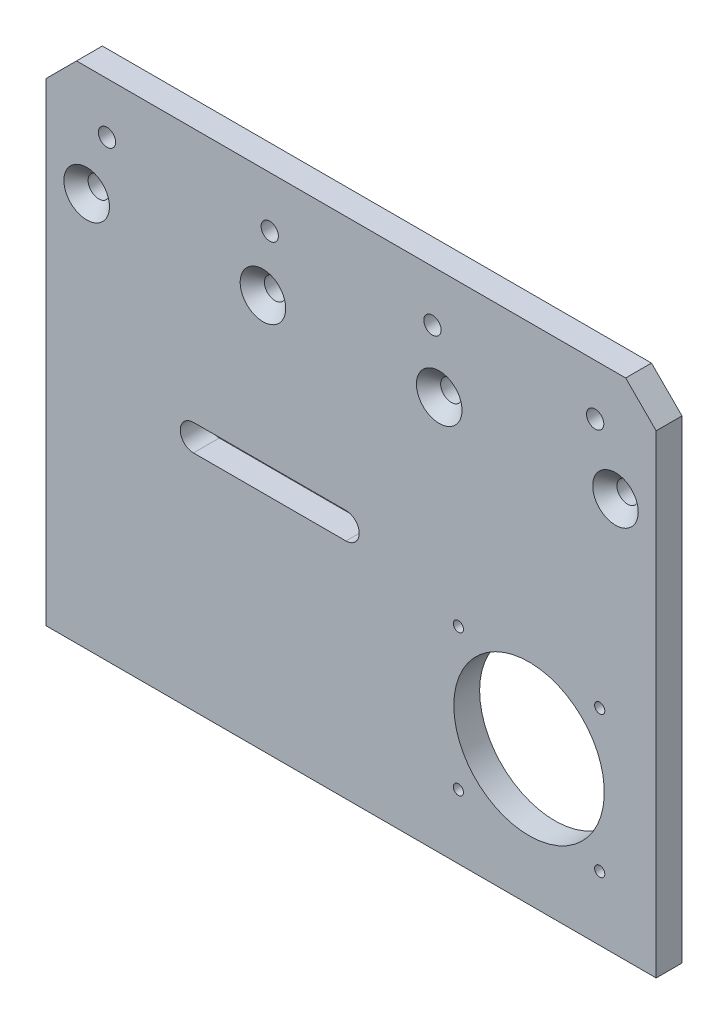
ISO-10303-21;
HEADER;
FILE_DESCRIPTION(('STEP AP214'),'2;1');
FILE_NAME('part.step','',(''),(''),'','','');
FILE_SCHEMA(('AUTOMOTIVE_DESIGN { 1 0 10303 214 1 1 1 1 }'));
ENDSEC;
DATA;
#1=APPLICATION_CONTEXT('core data for automotive mechanical design processes');
#2=APPLICATION_PROTOCOL_DEFINITION('international standard','automotive_design',2000,#1);
#3=PRODUCT_CONTEXT('',#1,'mechanical');
#4=PRODUCT('Part','Part','',(#3));
#5=PRODUCT_RELATED_PRODUCT_CATEGORY('part','',(#4));
#6=PRODUCT_DEFINITION_FORMATION('','',#4);
#7=PRODUCT_DEFINITION_CONTEXT('part definition',#1,'design');
#8=PRODUCT_DEFINITION('design','',#6,#7);
#9=PRODUCT_DEFINITION_SHAPE('','',#8);
#10=(LENGTH_UNIT() NAMED_UNIT(*) SI_UNIT(.MILLI.,.METRE.));
#11=(NAMED_UNIT(*) PLANE_ANGLE_UNIT() SI_UNIT($,.RADIAN.));
#12=(NAMED_UNIT(*) SI_UNIT($,.STERADIAN.) SOLID_ANGLE_UNIT());
#13=UNCERTAINTY_MEASURE_WITH_UNIT(LENGTH_MEASURE(1.E-05),#10,'distance_accuracy_value','');
#14=(GEOMETRIC_REPRESENTATION_CONTEXT(3) GLOBAL_UNCERTAINTY_ASSIGNED_CONTEXT((#13)) GLOBAL_UNIT_ASSIGNED_CONTEXT((#10,
#11,#12)) REPRESENTATION_CONTEXT('',''));
#15=CARTESIAN_POINT('',(0.,0.,0.));
#16=DIRECTION('',(0.,0.,1.));
#17=DIRECTION('',(1.,0.,0.));
#18=AXIS2_PLACEMENT_3D('',#15,#16,#17);
#19=CARTESIAN_POINT('',(-150.,-124.,-6.35));
#20=DIRECTION('',(-1.,0.,0.));
#21=DIRECTION('',(0.,0.,1.));
#22=AXIS2_PLACEMENT_3D('',#19,#20,#21);
#23=PLANE('',#22);
#24=DIRECTION('',(0.,-1.,0.));
#25=VECTOR('',#24,1.);
#26=CARTESIAN_POINT('',(-150.,-124.,6.35));
#27=LINE('',#26,#25);
#28=CARTESIAN_POINT('',(-150.,109.,6.35));
#29=VERTEX_POINT('',#28);
#30=CARTESIAN_POINT('',(-150.,-124.,6.35));
#31=VERTEX_POINT('',#30);
#32=EDGE_CURVE('E213',#29,#31,#27,.T.);
#33=ORIENTED_EDGE('',*,*,#32,.F.);
#34=DIRECTION('',(0.,0.,-1.));
#35=VECTOR('',#34,1.);
#36=CARTESIAN_POINT('',(-150.,109.,-6.35));
#37=LINE('',#36,#35);
#38=CARTESIAN_POINT('',(-150.,109.,-6.35));
#39=VERTEX_POINT('',#38);
#40=EDGE_CURVE('E243',#29,#39,#37,.T.);
#41=ORIENTED_EDGE('',*,*,#40,.T.);
#42=DIRECTION('',(0.,-1.,0.));
#43=VECTOR('',#42,1.);
#44=CARTESIAN_POINT('',(-150.,-124.,-6.35));
#45=LINE('',#44,#43);
#46=CARTESIAN_POINT('',(-150.,-124.,-6.35));
#47=VERTEX_POINT('',#46);
#48=EDGE_CURVE('E212',#39,#47,#45,.T.);
#49=ORIENTED_EDGE('',*,*,#48,.T.);
#50=DIRECTION('',(0.,0.,1.));
#51=VECTOR('',#50,1.);
#52=CARTESIAN_POINT('',(-150.,-124.,-6.35));
#53=LINE('',#52,#51);
#54=EDGE_CURVE('E228',#47,#31,#53,.T.);
#55=ORIENTED_EDGE('',*,*,#54,.T.);
#56=EDGE_LOOP('',(#33,#41,#49,#55));
#57=FACE_BOUND('',#56,.T.);
#58=ADVANCED_FACE('F50',(#57),#23,.T.);
#59=CARTESIAN_POINT('',(150.,124.,-6.35));
#60=DIRECTION('',(0.,1.,0.));
#61=DIRECTION('',(-1.,0.,0.));
#62=AXIS2_PLACEMENT_3D('',#59,#60,#61);
#63=PLANE('',#62);
#64=DIRECTION('',(-1.,0.,0.));
#65=VECTOR('',#64,1.);
#66=CARTESIAN_POINT('',(150.,124.,6.35));
#67=LINE('',#66,#65);
#68=CARTESIAN_POINT('',(135.,124.,6.35));
#69=VERTEX_POINT('',#68);
#70=CARTESIAN_POINT('',(-135.,124.,6.35));
#71=VERTEX_POINT('',#70);
#72=EDGE_CURVE('E217',#69,#71,#67,.T.);
#73=ORIENTED_EDGE('',*,*,#72,.F.);
#74=DIRECTION('',(0.,0.,-1.));
#75=VECTOR('',#74,1.);
#76=CARTESIAN_POINT('',(135.,124.,-6.35));
#77=LINE('',#76,#75);
#78=CARTESIAN_POINT('',(135.,124.,-6.35));
#79=VERTEX_POINT('',#78);
#80=EDGE_CURVE('E60',#69,#79,#77,.T.);
#81=ORIENTED_EDGE('',*,*,#80,.T.);
#82=DIRECTION('',(-1.,0.,0.));
#83=VECTOR('',#82,1.);
#84=CARTESIAN_POINT('',(150.,124.,-6.35));
#85=LINE('',#84,#83);
#86=CARTESIAN_POINT('',(-135.,124.,-6.35));
#87=VERTEX_POINT('',#86);
#88=EDGE_CURVE('E221',#79,#87,#85,.T.);
#89=ORIENTED_EDGE('',*,*,#88,.T.);
#90=DIRECTION('',(0.,0.,1.));
#91=VECTOR('',#90,1.);
#92=CARTESIAN_POINT('',(-135.,124.,-6.35));
#93=LINE('',#92,#91);
#94=EDGE_CURVE('E236',#87,#71,#93,.T.);
#95=ORIENTED_EDGE('',*,*,#94,.T.);
#96=EDGE_LOOP('',(#73,#81,#89,#95));
#97=FACE_BOUND('',#96,.T.);
#98=ADVANCED_FACE('F310',(#97),#63,.T.);
#99=CARTESIAN_POINT('',(150.,-124.,-6.35));
#100=DIRECTION('',(1.,0.,0.));
#101=DIRECTION('',(0.,1.,0.));
#102=AXIS2_PLACEMENT_3D('',#99,#100,#101);
#103=PLANE('',#102);
#104=DIRECTION('',(0.,1.,0.));
#105=VECTOR('',#104,1.);
#106=CARTESIAN_POINT('',(150.,-124.,-6.35));
#107=LINE('',#106,#105);
#108=CARTESIAN_POINT('',(150.,-124.,-6.35));
#109=VERTEX_POINT('',#108);
#110=CARTESIAN_POINT('',(150.,109.,-6.35));
#111=VERTEX_POINT('',#110);
#112=EDGE_CURVE('E222',#109,#111,#107,.T.);
#113=ORIENTED_EDGE('',*,*,#112,.T.);
#114=DIRECTION('',(0.,0.,1.));
#115=VECTOR('',#114,1.);
#116=CARTESIAN_POINT('',(150.,109.,-6.35));
#117=LINE('',#116,#115);
#118=CARTESIAN_POINT('',(150.,109.,6.35));
#119=VERTEX_POINT('',#118);
#120=EDGE_CURVE('E246',#111,#119,#117,.T.);
#121=ORIENTED_EDGE('',*,*,#120,.T.);
#122=DIRECTION('',(0.,1.,0.));
#123=VECTOR('',#122,1.);
#124=CARTESIAN_POINT('',(150.,-124.,6.35));
#125=LINE('',#124,#123);
#126=CARTESIAN_POINT('',(150.,-124.,6.35));
#127=VERTEX_POINT('',#126);
#128=EDGE_CURVE('E232',#127,#119,#125,.T.);
#129=ORIENTED_EDGE('',*,*,#128,.F.);
#130=DIRECTION('',(0.,0.,1.));
#131=VECTOR('',#130,1.);
#132=CARTESIAN_POINT('',(150.,-124.,-6.35));
#133=LINE('',#132,#131);
#134=EDGE_CURVE('E233',#109,#127,#133,.T.);
#135=ORIENTED_EDGE('',*,*,#134,.F.);
#136=EDGE_LOOP('',(#113,#121,#129,#135));
#137=FACE_BOUND('',#136,.T.);
#138=ADVANCED_FACE('F313',(#137),#103,.T.);
#139=CARTESIAN_POINT('',(150.,-124.,-6.35));
#140=DIRECTION('',(0.,-1.,0.));
#141=DIRECTION('',(1.,0.,0.));
#142=AXIS2_PLACEMENT_3D('',#139,#140,#141);
#143=PLANE('',#142);
#144=DIRECTION('',(1.,0.,0.));
#145=VECTOR('',#144,1.);
#146=CARTESIAN_POINT('',(150.,-124.,6.35));
#147=LINE('',#146,#145);
#148=EDGE_CURVE('E227',#31,#127,#147,.T.);
#149=ORIENTED_EDGE('',*,*,#148,.F.);
#150=ORIENTED_EDGE('',*,*,#54,.F.);
#151=DIRECTION('',(1.,0.,0.));
#152=VECTOR('',#151,1.);
#153=CARTESIAN_POINT('',(150.,-124.,-6.35));
#154=LINE('',#153,#152);
#155=EDGE_CURVE('E220',#47,#109,#154,.T.);
#156=ORIENTED_EDGE('',*,*,#155,.T.);
#157=ORIENTED_EDGE('',*,*,#134,.T.);
#158=EDGE_LOOP('',(#149,#150,#156,#157));
#159=FACE_BOUND('',#158,.T.);
#160=ADVANCED_FACE('F318',(#159),#143,.T.);
#161=CARTESIAN_POINT('',(0.,0.,-6.35));
#162=DIRECTION('',(0.,0.,1.));
#163=DIRECTION('',(1.,0.,0.));
#164=AXIS2_PLACEMENT_3D('',#161,#162,#163);
#165=PLANE('',#164);
#166=CARTESIAN_POINT('',(-130.,70.,-6.35));
#167=DIRECTION('',(0.,0.,1.));
#168=DIRECTION('',(1.,0.,0.));
#169=AXIS2_PLACEMENT_3D('',#166,#167,#168);
#170=CIRCLE('',#169,5.24999999999999);
#171=CARTESIAN_POINT('',(-124.75,70.,-6.35));
#172=VERTEX_POINT('',#171);
#173=EDGE_CURVE('E55',#172,#172,#170,.T.);
#174=ORIENTED_EDGE('',*,*,#173,.T.);
#175=EDGE_LOOP('',(#174));
#176=FACE_BOUND('',#175,.T.);
#177=CARTESIAN_POINT('',(-43.3333333333334,70.,-6.35));
#178=DIRECTION('',(0.,0.,1.));
#179=DIRECTION('',(1.,0.,0.));
#180=AXIS2_PLACEMENT_3D('',#177,#178,#179);
#181=CIRCLE('',#180,5.24999999999999);
#182=CARTESIAN_POINT('',(-38.0833333333334,70.,-6.35));
#183=VERTEX_POINT('',#182);
#184=EDGE_CURVE('E270',#183,#183,#181,.T.);
#185=ORIENTED_EDGE('',*,*,#184,.T.);
#186=EDGE_LOOP('',(#185));
#187=FACE_BOUND('',#186,.T.);
#188=CARTESIAN_POINT('',(43.3333333333333,70.,-6.35));
#189=DIRECTION('',(0.,0.,1.));
#190=DIRECTION('',(1.,0.,0.));
#191=AXIS2_PLACEMENT_3D('',#188,#189,#190);
#192=CIRCLE('',#191,5.24999999999999);
#193=CARTESIAN_POINT('',(48.5833333333333,70.,-6.35));
#194=VERTEX_POINT('',#193);
#195=EDGE_CURVE('E261',#194,#194,#192,.T.);
#196=ORIENTED_EDGE('',*,*,#195,.T.);
#197=EDGE_LOOP('',(#196));
#198=FACE_BOUND('',#197,.T.);
#199=CARTESIAN_POINT('',(130.,70.,-6.35));
#200=DIRECTION('',(0.,0.,1.));
#201=DIRECTION('',(1.,0.,0.));
#202=AXIS2_PLACEMENT_3D('',#199,#200,#201);
#203=CIRCLE('',#202,5.25);
#204=CARTESIAN_POINT('',(135.25,70.,-6.35));
#205=VERTEX_POINT('',#204);
#206=EDGE_CURVE('E160',#205,#205,#203,.T.);
#207=ORIENTED_EDGE('',*,*,#206,.T.);
#208=EDGE_LOOP('',(#207));
#209=FACE_BOUND('',#208,.T.);
#210=DIRECTION('',(1.,0.,0.));
#211=VECTOR('',#210,1.);
#212=CARTESIAN_POINT('',(-2.50000000000003,-14.164450338933,-6.35));
#213=LINE('',#212,#211);
#214=CARTESIAN_POINT('',(-77.5,-14.164450338933,-6.35));
#215=VERTEX_POINT('',#214);
#216=CARTESIAN_POINT('',(-2.50000000000003,-14.164450338933,-6.35));
#217=VERTEX_POINT('',#216);
#218=EDGE_CURVE('E131',#215,#217,#213,.T.);
#219=ORIENTED_EDGE('',*,*,#218,.T.);
#220=CARTESIAN_POINT('',(-2.50000000000003,-7.66445033893303,-6.35));
#221=DIRECTION('',(0.,0.,1.));
#222=DIRECTION('',(1.,0.,0.));
#223=AXIS2_PLACEMENT_3D('',#220,#221,#222);
#224=CIRCLE('',#223,6.5);
#225=CARTESIAN_POINT('',(-2.50000000000003,-1.16445033893304,-6.35));
#226=VERTEX_POINT('',#225);
#227=EDGE_CURVE('E127',#217,#226,#224,.T.);
#228=ORIENTED_EDGE('',*,*,#227,.T.);
#229=DIRECTION('',(-1.,0.,0.));
#230=VECTOR('',#229,1.);
#231=CARTESIAN_POINT('',(-2.50000000000003,-1.16445033893304,-6.35));
#232=LINE('',#231,#230);
#233=CARTESIAN_POINT('',(-77.5,-1.16445033893304,-6.35));
#234=VERTEX_POINT('',#233);
#235=EDGE_CURVE('E136',#226,#234,#232,.T.);
#236=ORIENTED_EDGE('',*,*,#235,.T.);
#237=CARTESIAN_POINT('',(-77.5,-7.66445033893304,-6.35));
#238=DIRECTION('',(0.,0.,1.));
#239=DIRECTION('',(1.,0.,0.));
#240=AXIS2_PLACEMENT_3D('',#237,#238,#239);
#241=CIRCLE('',#240,6.5);
#242=EDGE_CURVE('E62',#234,#215,#241,.T.);
#243=ORIENTED_EDGE('',*,*,#242,.T.);
#244=EDGE_LOOP('',(#219,#228,#236,#243));
#245=FACE_BOUND('',#244,.T.);
#246=CARTESIAN_POINT('',(122.25,-22.914450338933,-6.35));
#247=DIRECTION('',(0.,0.,-1.));
#248=DIRECTION('',(-1.,0.,0.));
#249=AXIS2_PLACEMENT_3D('',#246,#247,#248);
#250=CIRCLE('',#249,2.49999999999999);
#251=CARTESIAN_POINT('',(119.75,-22.914450338933,-6.35));
#252=VERTEX_POINT('',#251);
#253=EDGE_CURVE('E165',#252,#252,#250,.T.);
#254=ORIENTED_EDGE('',*,*,#253,.F.);
#255=EDGE_LOOP('',(#254));
#256=FACE_BOUND('',#255,.T.);
#257=CARTESIAN_POINT('',(52.75,-92.414450338933,-6.35));
#258=DIRECTION('',(0.,0.,-1.));
#259=DIRECTION('',(-1.,0.,0.));
#260=AXIS2_PLACEMENT_3D('',#257,#258,#259);
#261=CIRCLE('',#260,2.49999999999999);
#262=CARTESIAN_POINT('',(50.25,-92.414450338933,-6.35));
#263=VERTEX_POINT('',#262);
#264=EDGE_CURVE('E175',#263,#263,#261,.T.);
#265=ORIENTED_EDGE('',*,*,#264,.F.);
#266=EDGE_LOOP('',(#265));
#267=FACE_BOUND('',#266,.T.);
#268=CARTESIAN_POINT('',(52.75,-22.914450338933,-6.35));
#269=DIRECTION('',(0.,0.,-1.));
#270=DIRECTION('',(-1.,0.,0.));
#271=AXIS2_PLACEMENT_3D('',#268,#269,#270);
#272=CIRCLE('',#271,2.49999999999999);
#273=CARTESIAN_POINT('',(50.25,-22.914450338933,-6.35));
#274=VERTEX_POINT('',#273);
#275=EDGE_CURVE('E180',#274,#274,#272,.T.);
#276=ORIENTED_EDGE('',*,*,#275,.F.);
#277=EDGE_LOOP('',(#276));
#278=FACE_BOUND('',#277,.T.);
#279=CARTESIAN_POINT('',(122.25,-92.414450338933,-6.35));
#280=DIRECTION('',(0.,0.,-1.));
#281=DIRECTION('',(-1.,0.,0.));
#282=AXIS2_PLACEMENT_3D('',#279,#280,#281);
#283=CIRCLE('',#282,2.49999999999999);
#284=CARTESIAN_POINT('',(119.75,-92.414450338933,-6.35));
#285=VERTEX_POINT('',#284);
#286=EDGE_CURVE('E185',#285,#285,#283,.T.);
#287=ORIENTED_EDGE('',*,*,#286,.F.);
#288=EDGE_LOOP('',(#287));
#289=FACE_BOUND('',#288,.T.);
#290=CARTESIAN_POINT('',(87.5,-57.664450338933,-6.35));
#291=DIRECTION('',(0.,0.,-1.));
#292=DIRECTION('',(-1.,0.,0.));
#293=AXIS2_PLACEMENT_3D('',#290,#291,#292);
#294=CIRCLE('',#293,37.0000000000001);
#295=CARTESIAN_POINT('',(50.4999999999999,-57.664450338933,-6.35));
#296=VERTEX_POINT('',#295);
#297=EDGE_CURVE('E187',#296,#296,#294,.T.);
#298=ORIENTED_EDGE('',*,*,#297,.F.);
#299=EDGE_LOOP('',(#298));
#300=FACE_BOUND('',#299,.T.);
#301=CARTESIAN_POINT('',(-40.,99.,-6.35));
#302=DIRECTION('',(0.,0.,1.));
#303=DIRECTION('',(1.,0.,0.));
#304=AXIS2_PLACEMENT_3D('',#301,#302,#303);
#305=CIRCLE('',#304,4.24999999999999);
#306=CARTESIAN_POINT('',(-35.75,99.,-6.35));
#307=VERTEX_POINT('',#306);
#308=EDGE_CURVE('E197',#307,#307,#305,.T.);
#309=ORIENTED_EDGE('',*,*,#308,.T.);
#310=EDGE_LOOP('',(#309));
#311=FACE_BOUND('',#310,.T.);
#312=CARTESIAN_POINT('',(-120.,99.,-6.35));
#313=DIRECTION('',(0.,0.,1.));
#314=DIRECTION('',(1.,0.,0.));
#315=AXIS2_PLACEMENT_3D('',#312,#313,#314);
#316=CIRCLE('',#315,4.24999999999999);
#317=CARTESIAN_POINT('',(-115.75,99.,-6.35));
#318=VERTEX_POINT('',#317);
#319=EDGE_CURVE('E202',#318,#318,#316,.T.);
#320=ORIENTED_EDGE('',*,*,#319,.T.);
#321=EDGE_LOOP('',(#320));
#322=FACE_BOUND('',#321,.T.);
#323=CARTESIAN_POINT('',(40.,99.,-6.35));
#324=DIRECTION('',(0.,0.,1.));
#325=DIRECTION('',(1.,0.,0.));
#326=AXIS2_PLACEMENT_3D('',#323,#324,#325);
#327=CIRCLE('',#326,4.24999999999999);
#328=CARTESIAN_POINT('',(44.25,99.,-6.35));
#329=VERTEX_POINT('',#328);
#330=EDGE_CURVE('E210',#329,#329,#327,.T.);
#331=ORIENTED_EDGE('',*,*,#330,.T.);
#332=EDGE_LOOP('',(#331));
#333=FACE_BOUND('',#332,.T.);
#334=CARTESIAN_POINT('',(120.,99.,-6.35));
#335=DIRECTION('',(0.,0.,1.));
#336=DIRECTION('',(1.,0.,0.));
#337=AXIS2_PLACEMENT_3D('',#334,#335,#336);
#338=CIRCLE('',#337,4.24999999999999);
#339=CARTESIAN_POINT('',(124.25,99.,-6.35));
#340=VERTEX_POINT('',#339);
#341=EDGE_CURVE('E214',#340,#340,#338,.T.);
#342=ORIENTED_EDGE('',*,*,#341,.T.);
#343=EDGE_LOOP('',(#342));
#344=FACE_BOUND('',#343,.T.);
#345=ORIENTED_EDGE('',*,*,#88,.F.);
#346=DIRECTION('',(-0.707106781186547,0.707106781186548,0.));
#347=VECTOR('',#346,1.);
#348=CARTESIAN_POINT('',(150.,109.,-6.35));
#349=LINE('',#348,#347);
#350=EDGE_CURVE('E11',#79,#111,#349,.F.);
#351=ORIENTED_EDGE('',*,*,#350,.T.);
#352=ORIENTED_EDGE('',*,*,#112,.F.);
#353=ORIENTED_EDGE('',*,*,#155,.F.);
#354=ORIENTED_EDGE('',*,*,#48,.F.);
#355=DIRECTION('',(-0.707106781186548,-0.707106781186548,0.));
#356=VECTOR('',#355,1.);
#357=CARTESIAN_POINT('',(-135.,124.,-6.35));
#358=LINE('',#357,#356);
#359=EDGE_CURVE('E247',#39,#87,#358,.F.);
#360=ORIENTED_EDGE('',*,*,#359,.T.);
#361=EDGE_LOOP('',(#345,#351,#352,#353,#354,#360));
#362=FACE_BOUND('',#361,.T.);
#363=ADVANCED_FACE('F141',(#176,#187,#198,#209,#245,#256,#267,#278,#289,#300,#311,#322,#333,
#344,#362),#165,.F.);
#364=CARTESIAN_POINT('',(0.,0.,6.35));
#365=DIRECTION('',(0.,0.,1.));
#366=DIRECTION('',(1.,0.,0.));
#367=AXIS2_PLACEMENT_3D('',#364,#365,#366);
#368=PLANE('',#367);
#369=CARTESIAN_POINT('',(-130.,70.,6.35));
#370=DIRECTION('',(0.,0.,1.));
#371=DIRECTION('',(1.,0.,0.));
#372=AXIS2_PLACEMENT_3D('',#369,#370,#371);
#373=CIRCLE('',#372,11.2);
#374=CARTESIAN_POINT('',(-118.8,70.,6.35));
#375=VERTEX_POINT('',#374);
#376=EDGE_CURVE('E554',#375,#375,#373,.T.);
#377=ORIENTED_EDGE('',*,*,#376,.F.);
#378=EDGE_LOOP('',(#377));
#379=FACE_BOUND('',#378,.T.);
#380=CARTESIAN_POINT('',(-43.3333333333334,70.,6.35));
#381=DIRECTION('',(0.,0.,1.));
#382=DIRECTION('',(1.,0.,0.));
#383=AXIS2_PLACEMENT_3D('',#380,#381,#382);
#384=CIRCLE('',#383,11.2);
#385=CARTESIAN_POINT('',(-32.1333333333334,70.,6.35));
#386=VERTEX_POINT('',#385);
#387=EDGE_CURVE('E276',#386,#386,#384,.T.);
#388=ORIENTED_EDGE('',*,*,#387,.F.);
#389=EDGE_LOOP('',(#388));
#390=FACE_BOUND('',#389,.T.);
#391=CARTESIAN_POINT('',(43.3333333333333,70.,6.35));
#392=DIRECTION('',(0.,0.,1.));
#393=DIRECTION('',(1.,0.,0.));
#394=AXIS2_PLACEMENT_3D('',#391,#392,#393);
#395=CIRCLE('',#394,11.2);
#396=CARTESIAN_POINT('',(54.5333333333333,70.,6.35));
#397=VERTEX_POINT('',#396);
#398=EDGE_CURVE('E267',#397,#397,#395,.T.);
#399=ORIENTED_EDGE('',*,*,#398,.F.);
#400=EDGE_LOOP('',(#399));
#401=FACE_BOUND('',#400,.T.);
#402=CARTESIAN_POINT('',(130.,70.,6.35));
#403=DIRECTION('',(0.,0.,1.));
#404=DIRECTION('',(1.,0.,0.));
#405=AXIS2_PLACEMENT_3D('',#402,#403,#404);
#406=CIRCLE('',#405,11.2);
#407=CARTESIAN_POINT('',(141.2,70.,6.35));
#408=VERTEX_POINT('',#407);
#409=EDGE_CURVE('E262',#408,#408,#406,.T.);
#410=ORIENTED_EDGE('',*,*,#409,.F.);
#411=EDGE_LOOP('',(#410));
#412=FACE_BOUND('',#411,.T.);
#413=CARTESIAN_POINT('',(-2.50000000000003,-7.66445033893303,6.35));
#414=DIRECTION('',(0.,0.,1.));
#415=DIRECTION('',(1.,0.,0.));
#416=AXIS2_PLACEMENT_3D('',#413,#414,#415);
#417=CIRCLE('',#416,6.5);
#418=CARTESIAN_POINT('',(-2.50000000000003,-14.164450338933,6.35));
#419=VERTEX_POINT('',#418);
#420=CARTESIAN_POINT('',(-2.50000000000003,-1.16445033893304,6.35));
#421=VERTEX_POINT('',#420);
#422=EDGE_CURVE('E74',#419,#421,#417,.T.);
#423=ORIENTED_EDGE('',*,*,#422,.F.);
#424=DIRECTION('',(1.,0.,0.));
#425=VECTOR('',#424,1.);
#426=CARTESIAN_POINT('',(-2.50000000000003,-14.164450338933,6.35));
#427=LINE('',#426,#425);
#428=CARTESIAN_POINT('',(-77.5,-14.164450338933,6.35));
#429=VERTEX_POINT('',#428);
#430=EDGE_CURVE('E143',#429,#419,#427,.T.);
#431=ORIENTED_EDGE('',*,*,#430,.F.);
#432=CARTESIAN_POINT('',(-77.5,-7.66445033893304,6.35));
#433=DIRECTION('',(0.,0.,1.));
#434=DIRECTION('',(1.,0.,0.));
#435=AXIS2_PLACEMENT_3D('',#432,#433,#434);
#436=CIRCLE('',#435,6.5);
#437=CARTESIAN_POINT('',(-77.5,-1.16445033893304,6.35));
#438=VERTEX_POINT('',#437);
#439=EDGE_CURVE('E150',#438,#429,#436,.T.);
#440=ORIENTED_EDGE('',*,*,#439,.F.);
#441=DIRECTION('',(-1.,0.,0.));
#442=VECTOR('',#441,1.);
#443=CARTESIAN_POINT('',(-2.50000000000003,-1.16445033893304,6.35));
#444=LINE('',#443,#442);
#445=EDGE_CURVE('E157',#421,#438,#444,.T.);
#446=ORIENTED_EDGE('',*,*,#445,.F.);
#447=EDGE_LOOP('',(#423,#431,#440,#446));
#448=FACE_BOUND('',#447,.T.);
#449=CARTESIAN_POINT('',(122.25,-22.914450338933,6.35));
#450=DIRECTION('',(0.,0.,-1.));
#451=DIRECTION('',(-1.,0.,0.));
#452=AXIS2_PLACEMENT_3D('',#449,#450,#451);
#453=CIRCLE('',#452,2.5);
#454=CARTESIAN_POINT('',(119.75,-22.914450338933,6.35));
#455=VERTEX_POINT('',#454);
#456=EDGE_CURVE('E168',#455,#455,#453,.T.);
#457=ORIENTED_EDGE('',*,*,#456,.T.);
#458=EDGE_LOOP('',(#457));
#459=FACE_BOUND('',#458,.T.);
#460=CARTESIAN_POINT('',(52.75,-92.414450338933,6.35));
#461=DIRECTION('',(0.,0.,-1.));
#462=DIRECTION('',(-1.,0.,0.));
#463=AXIS2_PLACEMENT_3D('',#460,#461,#462);
#464=CIRCLE('',#463,2.5);
#465=CARTESIAN_POINT('',(50.25,-92.414450338933,6.35));
#466=VERTEX_POINT('',#465);
#467=EDGE_CURVE('E173',#466,#466,#464,.T.);
#468=ORIENTED_EDGE('',*,*,#467,.T.);
#469=EDGE_LOOP('',(#468));
#470=FACE_BOUND('',#469,.T.);
#471=CARTESIAN_POINT('',(52.75,-22.914450338933,6.35));
#472=DIRECTION('',(0.,0.,-1.));
#473=DIRECTION('',(-1.,0.,0.));
#474=AXIS2_PLACEMENT_3D('',#471,#472,#473);
#475=CIRCLE('',#474,2.5);
#476=CARTESIAN_POINT('',(50.25,-22.914450338933,6.35));
#477=VERTEX_POINT('',#476);
#478=EDGE_CURVE('E183',#477,#477,#475,.T.);
#479=ORIENTED_EDGE('',*,*,#478,.T.);
#480=EDGE_LOOP('',(#479));
#481=FACE_BOUND('',#480,.T.);
#482=CARTESIAN_POINT('',(122.25,-92.414450338933,6.35));
#483=DIRECTION('',(0.,0.,-1.));
#484=DIRECTION('',(-1.,0.,0.));
#485=AXIS2_PLACEMENT_3D('',#482,#483,#484);
#486=CIRCLE('',#485,2.5);
#487=CARTESIAN_POINT('',(119.75,-92.414450338933,6.35));
#488=VERTEX_POINT('',#487);
#489=EDGE_CURVE('E190',#488,#488,#486,.T.);
#490=ORIENTED_EDGE('',*,*,#489,.T.);
#491=EDGE_LOOP('',(#490));
#492=FACE_BOUND('',#491,.T.);
#493=CARTESIAN_POINT('',(87.5,-57.664450338933,6.35));
#494=DIRECTION('',(0.,0.,-1.));
#495=DIRECTION('',(-1.,0.,0.));
#496=AXIS2_PLACEMENT_3D('',#493,#494,#495);
#497=CIRCLE('',#496,37.0000000000001);
#498=CARTESIAN_POINT('',(50.4999999999999,-57.664450338933,6.35));
#499=VERTEX_POINT('',#498);
#500=EDGE_CURVE('E191',#499,#499,#497,.T.);
#501=ORIENTED_EDGE('',*,*,#500,.T.);
#502=EDGE_LOOP('',(#501));
#503=FACE_BOUND('',#502,.T.);
#504=CARTESIAN_POINT('',(-40.,99.,6.35));
#505=DIRECTION('',(0.,0.,1.));
#506=DIRECTION('',(1.,0.,0.));
#507=AXIS2_PLACEMENT_3D('',#504,#505,#506);
#508=CIRCLE('',#507,4.24999999999999);
#509=CARTESIAN_POINT('',(-35.75,99.,6.35));
#510=VERTEX_POINT('',#509);
#511=EDGE_CURVE('E192',#510,#510,#508,.T.);
#512=ORIENTED_EDGE('',*,*,#511,.F.);
#513=EDGE_LOOP('',(#512));
#514=FACE_BOUND('',#513,.T.);
#515=CARTESIAN_POINT('',(-120.,99.,6.35));
#516=DIRECTION('',(0.,0.,1.));
#517=DIRECTION('',(1.,0.,0.));
#518=AXIS2_PLACEMENT_3D('',#515,#516,#517);
#519=CIRCLE('',#518,4.24999999999999);
#520=CARTESIAN_POINT('',(-115.75,99.,6.35));
#521=VERTEX_POINT('',#520);
#522=EDGE_CURVE('E199',#521,#521,#519,.T.);
#523=ORIENTED_EDGE('',*,*,#522,.F.);
#524=EDGE_LOOP('',(#523));
#525=FACE_BOUND('',#524,.T.);
#526=CARTESIAN_POINT('',(40.,99.,6.35));
#527=DIRECTION('',(0.,0.,1.));
#528=DIRECTION('',(1.,0.,0.));
#529=AXIS2_PLACEMENT_3D('',#526,#527,#528);
#530=CIRCLE('',#529,4.24999999999999);
#531=CARTESIAN_POINT('',(44.25,99.,6.35));
#532=VERTEX_POINT('',#531);
#533=EDGE_CURVE('E203',#532,#532,#530,.T.);
#534=ORIENTED_EDGE('',*,*,#533,.F.);
#535=EDGE_LOOP('',(#534));
#536=FACE_BOUND('',#535,.T.);
#537=CARTESIAN_POINT('',(120.,99.,6.35));
#538=DIRECTION('',(0.,0.,1.));
#539=DIRECTION('',(1.,0.,0.));
#540=AXIS2_PLACEMENT_3D('',#537,#538,#539);
#541=CIRCLE('',#540,4.24999999999999);
#542=CARTESIAN_POINT('',(124.25,99.,6.35));
#543=VERTEX_POINT('',#542);
#544=EDGE_CURVE('E209',#543,#543,#541,.T.);
#545=ORIENTED_EDGE('',*,*,#544,.F.);
#546=EDGE_LOOP('',(#545));
#547=FACE_BOUND('',#546,.T.);
#548=ORIENTED_EDGE('',*,*,#128,.T.);
#549=DIRECTION('',(0.707106781186547,-0.707106781186548,0.));
#550=VECTOR('',#549,1.);
#551=CARTESIAN_POINT('',(129.5,129.5,6.35));
#552=LINE('',#551,#550);
#553=EDGE_CURVE('E251',#119,#69,#552,.F.);
#554=ORIENTED_EDGE('',*,*,#553,.T.);
#555=ORIENTED_EDGE('',*,*,#72,.T.);
#556=DIRECTION('',(0.707106781186548,0.707106781186548,0.));
#557=VECTOR('',#556,1.);
#558=CARTESIAN_POINT('',(-129.5,129.5,6.35));
#559=LINE('',#558,#557);
#560=EDGE_CURVE('E245',#71,#29,#559,.F.);
#561=ORIENTED_EDGE('',*,*,#560,.T.);
#562=ORIENTED_EDGE('',*,*,#32,.T.);
#563=ORIENTED_EDGE('',*,*,#148,.T.);
#564=EDGE_LOOP('',(#548,#554,#555,#561,#562,#563));
#565=FACE_BOUND('',#564,.T.);
#566=ADVANCED_FACE('F329',(#379,#390,#401,#412,#448,#459,#470,#481,#492,#503,#514,#525,#536,
#547,#565),#368,.T.);
#567=CARTESIAN_POINT('',(-135.,124.,-6.35));
#568=DIRECTION('',(0.707106781186548,-0.707106781186548,0.));
#569=DIRECTION('',(0.,0.,1.));
#570=AXIS2_PLACEMENT_3D('',#567,#568,#569);
#571=PLANE('',#570);
#572=ORIENTED_EDGE('',*,*,#359,.F.);
#573=ORIENTED_EDGE('',*,*,#40,.F.);
#574=ORIENTED_EDGE('',*,*,#560,.F.);
#575=ORIENTED_EDGE('',*,*,#94,.F.);
#576=EDGE_LOOP('',(#572,#573,#574,#575));
#577=FACE_BOUND('',#576,.T.);
#578=ADVANCED_FACE('F325',(#577),#571,.F.);
#579=CARTESIAN_POINT('',(150.,109.,-6.35));
#580=DIRECTION('',(-0.707106781186548,-0.707106781186547,0.));
#581=DIRECTION('',(0.,0.,1.));
#582=AXIS2_PLACEMENT_3D('',#579,#580,#581);
#583=PLANE('',#582);
#584=ORIENTED_EDGE('',*,*,#350,.F.);
#585=ORIENTED_EDGE('',*,*,#80,.F.);
#586=ORIENTED_EDGE('',*,*,#553,.F.);
#587=ORIENTED_EDGE('',*,*,#120,.F.);
#588=EDGE_LOOP('',(#584,#585,#586,#587));
#589=FACE_BOUND('',#588,.T.);
#590=ADVANCED_FACE('F49',(#589),#583,.F.);
#591=CARTESIAN_POINT('',(120.,99.,6.35));
#592=DIRECTION('',(0.,0.,1.));
#593=DIRECTION('',(1.,0.,0.));
#594=AXIS2_PLACEMENT_3D('',#591,#592,#593);
#595=CYLINDRICAL_SURFACE('',#594,4.24999999999999);
#596=ORIENTED_EDGE('',*,*,#544,.T.);
#597=EDGE_LOOP('',(#596));
#598=FACE_BOUND('',#597,.T.);
#599=ORIENTED_EDGE('',*,*,#341,.F.);
#600=EDGE_LOOP('',(#599));
#601=FACE_BOUND('',#600,.T.);
#602=ADVANCED_FACE('F332',(#598,#601),#595,.F.);
#603=CARTESIAN_POINT('',(40.,99.,6.35));
#604=DIRECTION('',(0.,0.,1.));
#605=DIRECTION('',(1.,0.,0.));
#606=AXIS2_PLACEMENT_3D('',#603,#604,#605);
#607=CYLINDRICAL_SURFACE('',#606,4.24999999999999);
#608=ORIENTED_EDGE('',*,*,#533,.T.);
#609=EDGE_LOOP('',(#608));
#610=FACE_BOUND('',#609,.T.);
#611=ORIENTED_EDGE('',*,*,#330,.F.);
#612=EDGE_LOOP('',(#611));
#613=FACE_BOUND('',#612,.T.);
#614=ADVANCED_FACE('F363',(#610,#613),#607,.F.);
#615=CARTESIAN_POINT('',(-120.,99.,6.35));
#616=DIRECTION('',(0.,0.,1.));
#617=DIRECTION('',(1.,0.,0.));
#618=AXIS2_PLACEMENT_3D('',#615,#616,#617);
#619=CYLINDRICAL_SURFACE('',#618,4.24999999999999);
#620=ORIENTED_EDGE('',*,*,#522,.T.);
#621=EDGE_LOOP('',(#620));
#622=FACE_BOUND('',#621,.T.);
#623=ORIENTED_EDGE('',*,*,#319,.F.);
#624=EDGE_LOOP('',(#623));
#625=FACE_BOUND('',#624,.T.);
#626=ADVANCED_FACE('F367',(#622,#625),#619,.F.);
#627=CARTESIAN_POINT('',(-40.,99.,6.35));
#628=DIRECTION('',(0.,0.,1.));
#629=DIRECTION('',(1.,0.,0.));
#630=AXIS2_PLACEMENT_3D('',#627,#628,#629);
#631=CYLINDRICAL_SURFACE('',#630,4.24999999999999);
#632=ORIENTED_EDGE('',*,*,#511,.T.);
#633=EDGE_LOOP('',(#632));
#634=FACE_BOUND('',#633,.T.);
#635=ORIENTED_EDGE('',*,*,#308,.F.);
#636=EDGE_LOOP('',(#635));
#637=FACE_BOUND('',#636,.T.);
#638=ADVANCED_FACE('F375',(#634,#637),#631,.F.);
#639=CARTESIAN_POINT('',(87.5,-57.664450338933,6.35));
#640=DIRECTION('',(0.,0.,-1.));
#641=DIRECTION('',(-1.,0.,0.));
#642=AXIS2_PLACEMENT_3D('',#639,#640,#641);
#643=CYLINDRICAL_SURFACE('',#642,37.0000000000001);
#644=ORIENTED_EDGE('',*,*,#500,.F.);
#645=EDGE_LOOP('',(#644));
#646=FACE_BOUND('',#645,.T.);
#647=ORIENTED_EDGE('',*,*,#297,.T.);
#648=EDGE_LOOP('',(#647));
#649=FACE_BOUND('',#648,.T.);
#650=ADVANCED_FACE('F378',(#646,#649),#643,.F.);
#651=CARTESIAN_POINT('',(122.25,-92.414450338933,-6.35));
#652=DIRECTION('',(0.,0.,-1.));
#653=DIRECTION('',(-1.,0.,0.));
#654=AXIS2_PLACEMENT_3D('',#651,#652,#653);
#655=CYLINDRICAL_SURFACE('',#654,2.5);
#656=ORIENTED_EDGE('',*,*,#489,.F.);
#657=EDGE_LOOP('',(#656));
#658=FACE_BOUND('',#657,.T.);
#659=ORIENTED_EDGE('',*,*,#286,.T.);
#660=EDGE_LOOP('',(#659));
#661=FACE_BOUND('',#660,.T.);
#662=ADVANCED_FACE('F376',(#658,#661),#655,.F.);
#663=CARTESIAN_POINT('',(52.75,-22.914450338933,-6.35));
#664=DIRECTION('',(0.,0.,-1.));
#665=DIRECTION('',(-1.,0.,0.));
#666=AXIS2_PLACEMENT_3D('',#663,#664,#665);
#667=CYLINDRICAL_SURFACE('',#666,2.49999999999999);
#668=ORIENTED_EDGE('',*,*,#478,.F.);
#669=EDGE_LOOP('',(#668));
#670=FACE_BOUND('',#669,.T.);
#671=ORIENTED_EDGE('',*,*,#275,.T.);
#672=EDGE_LOOP('',(#671));
#673=FACE_BOUND('',#672,.T.);
#674=ADVANCED_FACE('F384',(#670,#673),#667,.F.);
#675=CARTESIAN_POINT('',(52.75,-92.414450338933,-6.35));
#676=DIRECTION('',(0.,0.,-1.));
#677=DIRECTION('',(-1.,0.,0.));
#678=AXIS2_PLACEMENT_3D('',#675,#676,#677);
#679=CYLINDRICAL_SURFACE('',#678,2.49999999999999);
#680=ORIENTED_EDGE('',*,*,#467,.F.);
#681=EDGE_LOOP('',(#680));
#682=FACE_BOUND('',#681,.T.);
#683=ORIENTED_EDGE('',*,*,#264,.T.);
#684=EDGE_LOOP('',(#683));
#685=FACE_BOUND('',#684,.T.);
#686=ADVANCED_FACE('F390',(#682,#685),#679,.F.);
#687=CARTESIAN_POINT('',(122.25,-22.914450338933,-6.35));
#688=DIRECTION('',(0.,0.,-1.));
#689=DIRECTION('',(-1.,0.,0.));
#690=AXIS2_PLACEMENT_3D('',#687,#688,#689);
#691=CYLINDRICAL_SURFACE('',#690,2.5);
#692=ORIENTED_EDGE('',*,*,#456,.F.);
#693=EDGE_LOOP('',(#692));
#694=FACE_BOUND('',#693,.T.);
#695=ORIENTED_EDGE('',*,*,#253,.T.);
#696=EDGE_LOOP('',(#695));
#697=FACE_BOUND('',#696,.T.);
#698=ADVANCED_FACE('F395',(#694,#697),#691,.F.);
#699=CARTESIAN_POINT('',(-2.50000000000003,-7.66445033893303,-6.35));
#700=DIRECTION('',(0.,0.,1.));
#701=DIRECTION('',(1.,0.,0.));
#702=AXIS2_PLACEMENT_3D('',#699,#700,#701);
#703=CYLINDRICAL_SURFACE('',#702,6.5);
#704=ORIENTED_EDGE('',*,*,#422,.T.);
#705=DIRECTION('',(0.,0.,1.));
#706=VECTOR('',#705,1.);
#707=CARTESIAN_POINT('',(-2.50000000000003,-1.16445033893304,-6.35));
#708=LINE('',#707,#706);
#709=EDGE_CURVE('E122',#226,#421,#708,.T.);
#710=ORIENTED_EDGE('',*,*,#709,.F.);
#711=ORIENTED_EDGE('',*,*,#227,.F.);
#712=DIRECTION('',(0.,0.,1.));
#713=VECTOR('',#712,1.);
#714=CARTESIAN_POINT('',(-2.50000000000003,-14.164450338933,-6.35));
#715=LINE('',#714,#713);
#716=EDGE_CURVE('E164',#217,#419,#715,.T.);
#717=ORIENTED_EDGE('',*,*,#716,.T.);
#718=EDGE_LOOP('',(#704,#710,#711,#717));
#719=FACE_BOUND('',#718,.T.);
#720=ADVANCED_FACE('F126',(#719),#703,.F.);
#721=CARTESIAN_POINT('',(-2.50000000000003,-14.164450338933,-6.35));
#722=DIRECTION('',(0.,-1.,0.));
#723=DIRECTION('',(1.,0.,0.));
#724=AXIS2_PLACEMENT_3D('',#721,#722,#723);
#725=PLANE('',#724);
#726=ORIENTED_EDGE('',*,*,#430,.T.);
#727=ORIENTED_EDGE('',*,*,#716,.F.);
#728=ORIENTED_EDGE('',*,*,#218,.F.);
#729=DIRECTION('',(0.,0.,1.));
#730=VECTOR('',#729,1.);
#731=CARTESIAN_POINT('',(-77.5,-14.164450338933,-6.35));
#732=LINE('',#731,#730);
#733=EDGE_CURVE('E163',#215,#429,#732,.T.);
#734=ORIENTED_EDGE('',*,*,#733,.T.);
#735=EDGE_LOOP('',(#726,#727,#728,#734));
#736=FACE_BOUND('',#735,.T.);
#737=ADVANCED_FACE('F396',(#736),#725,.F.);
#738=CARTESIAN_POINT('',(-77.5,-7.66445033893304,-6.35));
#739=DIRECTION('',(0.,0.,1.));
#740=DIRECTION('',(1.,0.,0.));
#741=AXIS2_PLACEMENT_3D('',#738,#739,#740);
#742=CYLINDRICAL_SURFACE('',#741,6.5);
#743=ORIENTED_EDGE('',*,*,#439,.T.);
#744=ORIENTED_EDGE('',*,*,#733,.F.);
#745=ORIENTED_EDGE('',*,*,#242,.F.);
#746=DIRECTION('',(0.,0.,1.));
#747=VECTOR('',#746,1.);
#748=CARTESIAN_POINT('',(-77.5,-1.16445033893304,-6.35));
#749=LINE('',#748,#747);
#750=EDGE_CURVE('E134',#234,#438,#749,.T.);
#751=ORIENTED_EDGE('',*,*,#750,.T.);
#752=EDGE_LOOP('',(#743,#744,#745,#751));
#753=FACE_BOUND('',#752,.T.);
#754=ADVANCED_FACE('F401',(#753),#742,.F.);
#755=CARTESIAN_POINT('',(-2.50000000000003,-1.16445033893304,-6.35));
#756=DIRECTION('',(0.,1.,0.));
#757=DIRECTION('',(-1.,0.,0.));
#758=AXIS2_PLACEMENT_3D('',#755,#756,#757);
#759=PLANE('',#758);
#760=ORIENTED_EDGE('',*,*,#445,.T.);
#761=ORIENTED_EDGE('',*,*,#750,.F.);
#762=ORIENTED_EDGE('',*,*,#235,.F.);
#763=ORIENTED_EDGE('',*,*,#709,.T.);
#764=EDGE_LOOP('',(#760,#761,#762,#763));
#765=FACE_BOUND('',#764,.T.);
#766=ADVANCED_FACE('F140',(#765),#759,.F.);
#767=CARTESIAN_POINT('',(130.,70.,6.35));
#768=DIRECTION('',(0.,0.,1.));
#769=DIRECTION('',(1.,0.,0.));
#770=AXIS2_PLACEMENT_3D('',#767,#768,#769);
#771=CYLINDRICAL_SURFACE('',#770,5.25);
#772=CARTESIAN_POINT('',(130.,70.,0.399999999999999));
#773=DIRECTION('',(0.,0.,1.));
#774=DIRECTION('',(1.,0.,0.));
#775=AXIS2_PLACEMENT_3D('',#772,#773,#774);
#776=CIRCLE('',#775,5.25);
#777=CARTESIAN_POINT('',(135.25,70.,0.399999999999999));
#778=VERTEX_POINT('',#777);
#779=EDGE_CURVE('E148',#778,#778,#776,.T.);
#780=ORIENTED_EDGE('',*,*,#779,.T.);
#781=EDGE_LOOP('',(#780));
#782=FACE_BOUND('',#781,.T.);
#783=ORIENTED_EDGE('',*,*,#206,.F.);
#784=EDGE_LOOP('',(#783));
#785=FACE_BOUND('',#784,.T.);
#786=ADVANCED_FACE('F291',(#782,#785),#771,.F.);
#787=CARTESIAN_POINT('',(130.,70.,6.35));
#788=DIRECTION('',(0.,0.,1.));
#789=DIRECTION('',(1.,0.,0.));
#790=AXIS2_PLACEMENT_3D('',#787,#788,#789);
#791=CONICAL_SURFACE('',#790,11.2,0.785398163397447);
#792=ORIENTED_EDGE('',*,*,#779,.F.);
#793=EDGE_LOOP('',(#792));
#794=FACE_BOUND('',#793,.T.);
#795=ORIENTED_EDGE('',*,*,#409,.T.);
#796=EDGE_LOOP('',(#795));
#797=FACE_BOUND('',#796,.T.);
#798=ADVANCED_FACE('F293',(#794,#797),#791,.F.);
#799=CARTESIAN_POINT('',(43.3333333333333,70.,6.35));
#800=DIRECTION('',(0.,0.,1.));
#801=DIRECTION('',(1.,0.,0.));
#802=AXIS2_PLACEMENT_3D('',#799,#800,#801);
#803=CYLINDRICAL_SURFACE('',#802,5.24999999999999);
#804=CARTESIAN_POINT('',(43.3333333333333,70.,0.399999999999999));
#805=DIRECTION('',(0.,0.,1.));
#806=DIRECTION('',(1.,0.,0.));
#807=AXIS2_PLACEMENT_3D('',#804,#805,#806);
#808=CIRCLE('',#807,5.25);
#809=CARTESIAN_POINT('',(48.5833333333333,70.,0.399999999999999));
#810=VERTEX_POINT('',#809);
#811=EDGE_CURVE('E266',#810,#810,#808,.T.);
#812=ORIENTED_EDGE('',*,*,#811,.T.);
#813=EDGE_LOOP('',(#812));
#814=FACE_BOUND('',#813,.T.);
#815=ORIENTED_EDGE('',*,*,#195,.F.);
#816=EDGE_LOOP('',(#815));
#817=FACE_BOUND('',#816,.T.);
#818=ADVANCED_FACE('F297',(#814,#817),#803,.F.);
#819=CARTESIAN_POINT('',(43.3333333333333,70.,6.35));
#820=DIRECTION('',(0.,0.,1.));
#821=DIRECTION('',(1.,0.,0.));
#822=AXIS2_PLACEMENT_3D('',#819,#820,#821);
#823=CONICAL_SURFACE('',#822,11.2,0.785398163397449);
#824=ORIENTED_EDGE('',*,*,#811,.F.);
#825=EDGE_LOOP('',(#824));
#826=FACE_BOUND('',#825,.T.);
#827=ORIENTED_EDGE('',*,*,#398,.T.);
#828=EDGE_LOOP('',(#827));
#829=FACE_BOUND('',#828,.T.);
#830=ADVANCED_FACE('F304',(#826,#829),#823,.F.);
#831=CARTESIAN_POINT('',(-43.3333333333334,70.,6.35));
#832=DIRECTION('',(0.,0.,1.));
#833=DIRECTION('',(1.,0.,0.));
#834=AXIS2_PLACEMENT_3D('',#831,#832,#833);
#835=CYLINDRICAL_SURFACE('',#834,5.24999999999999);
#836=CARTESIAN_POINT('',(-43.3333333333334,70.,0.399999999999999));
#837=DIRECTION('',(0.,0.,1.));
#838=DIRECTION('',(1.,0.,0.));
#839=AXIS2_PLACEMENT_3D('',#836,#837,#838);
#840=CIRCLE('',#839,5.25);
#841=CARTESIAN_POINT('',(-38.0833333333334,70.,0.399999999999999));
#842=VERTEX_POINT('',#841);
#843=EDGE_CURVE('E269',#842,#842,#840,.T.);
#844=ORIENTED_EDGE('',*,*,#843,.T.);
#845=EDGE_LOOP('',(#844));
#846=FACE_BOUND('',#845,.T.);
#847=ORIENTED_EDGE('',*,*,#184,.F.);
#848=EDGE_LOOP('',(#847));
#849=FACE_BOUND('',#848,.T.);
#850=ADVANCED_FACE('F502',(#846,#849),#835,.F.);
#851=CARTESIAN_POINT('',(-43.3333333333334,70.,6.35));
#852=DIRECTION('',(0.,0.,1.));
#853=DIRECTION('',(1.,0.,0.));
#854=AXIS2_PLACEMENT_3D('',#851,#852,#853);
#855=CONICAL_SURFACE('',#854,11.2,0.785398163397449);
#856=ORIENTED_EDGE('',*,*,#843,.F.);
#857=EDGE_LOOP('',(#856));
#858=FACE_BOUND('',#857,.T.);
#859=ORIENTED_EDGE('',*,*,#387,.T.);
#860=EDGE_LOOP('',(#859));
#861=FACE_BOUND('',#860,.T.);
#862=ADVANCED_FACE('F515',(#858,#861),#855,.F.);
#863=CARTESIAN_POINT('',(-130.,70.,6.35));
#864=DIRECTION('',(0.,0.,1.));
#865=DIRECTION('',(1.,0.,0.));
#866=AXIS2_PLACEMENT_3D('',#863,#864,#865);
#867=CYLINDRICAL_SURFACE('',#866,5.24999999999999);
#868=CARTESIAN_POINT('',(-130.,70.,0.399999999999999));
#869=DIRECTION('',(0.,0.,1.));
#870=DIRECTION('',(1.,0.,0.));
#871=AXIS2_PLACEMENT_3D('',#868,#869,#870);
#872=CIRCLE('',#871,5.24999999999999);
#873=CARTESIAN_POINT('',(-124.75,70.,0.399999999999999));
#874=VERTEX_POINT('',#873);
#875=EDGE_CURVE('E549',#874,#874,#872,.T.);
#876=ORIENTED_EDGE('',*,*,#875,.T.);
#877=EDGE_LOOP('',(#876));
#878=FACE_BOUND('',#877,.T.);
#879=ORIENTED_EDGE('',*,*,#173,.F.);
#880=EDGE_LOOP('',(#879));
#881=FACE_BOUND('',#880,.T.);
#882=ADVANCED_FACE('F525',(#878,#881),#867,.F.);
#883=CARTESIAN_POINT('',(-130.,70.,6.35));
#884=DIRECTION('',(0.,0.,1.));
#885=DIRECTION('',(1.,0.,0.));
#886=AXIS2_PLACEMENT_3D('',#883,#884,#885);
#887=CONICAL_SURFACE('',#886,11.2,0.785398163397449);
#888=ORIENTED_EDGE('',*,*,#875,.F.);
#889=EDGE_LOOP('',(#888));
#890=FACE_BOUND('',#889,.T.);
#891=ORIENTED_EDGE('',*,*,#376,.T.);
#892=EDGE_LOOP('',(#891));
#893=FACE_BOUND('',#892,.T.);
#894=ADVANCED_FACE('F535',(#890,#893),#887,.F.);
#895=CLOSED_SHELL('',(#58,#98,#138,#160,#363,#566,#578,#590,#602,#614,#626,#638,#650,#662,#674,
#686,#698,#720,#737,#754,#766,#786,#798,#818,#830,#850,#862,#882,#894));
#896=MANIFOLD_SOLID_BREP('B2',#895);
#897=ADVANCED_BREP_SHAPE_REPRESENTATION('',(#18,#896),#14);
#898=SHAPE_DEFINITION_REPRESENTATION(#9,#897);
ENDSEC;
END-ISO-10303-21;
